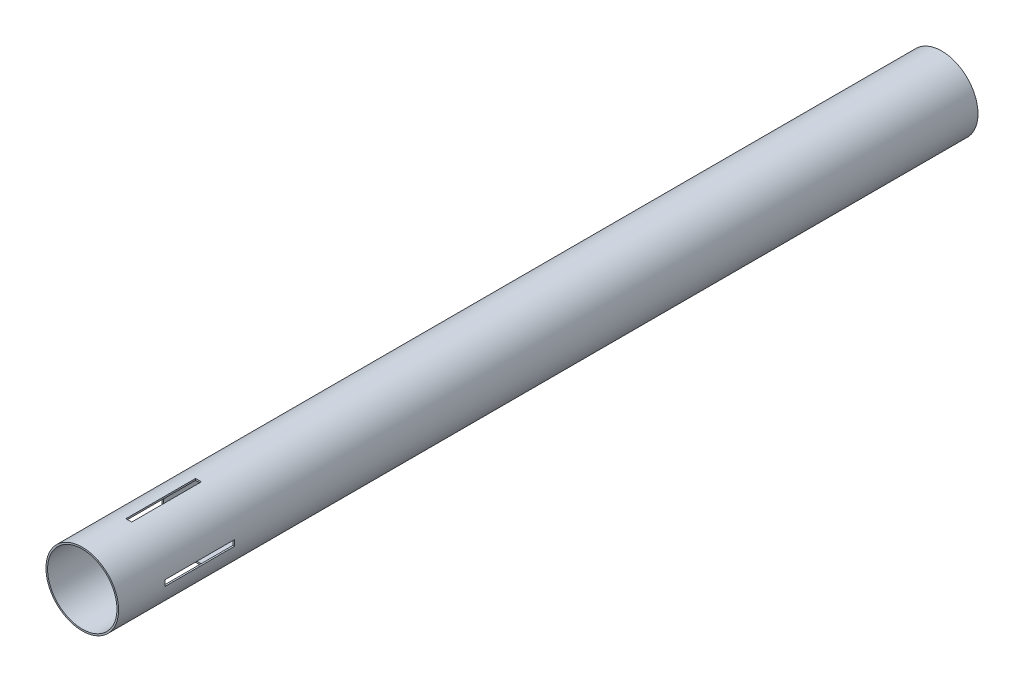
ISO-10303-21;
HEADER;
FILE_DESCRIPTION(('STEP AP214'),'2;1');
FILE_NAME('part.step','',(''),(''),'','','');
FILE_SCHEMA(('AUTOMOTIVE_DESIGN { 1 0 10303 214 1 1 1 1 }'));
ENDSEC;
DATA;
#1=APPLICATION_CONTEXT('core data for automotive mechanical design processes');
#2=APPLICATION_PROTOCOL_DEFINITION('international standard','automotive_design',2000,#1);
#3=PRODUCT_CONTEXT('',#1,'mechanical');
#4=PRODUCT('Part','Part','',(#3));
#5=PRODUCT_RELATED_PRODUCT_CATEGORY('part','',(#4));
#6=PRODUCT_DEFINITION_FORMATION('','',#4);
#7=PRODUCT_DEFINITION_CONTEXT('part definition',#1,'design');
#8=PRODUCT_DEFINITION('design','',#6,#7);
#9=PRODUCT_DEFINITION_SHAPE('','',#8);
#10=(LENGTH_UNIT() NAMED_UNIT(*) SI_UNIT(.MILLI.,.METRE.));
#11=(NAMED_UNIT(*) PLANE_ANGLE_UNIT() SI_UNIT($,.RADIAN.));
#12=(NAMED_UNIT(*) SI_UNIT($,.STERADIAN.) SOLID_ANGLE_UNIT());
#13=UNCERTAINTY_MEASURE_WITH_UNIT(LENGTH_MEASURE(1.E-05),#10,'distance_accuracy_value','');
#14=(GEOMETRIC_REPRESENTATION_CONTEXT(3) GLOBAL_UNCERTAINTY_ASSIGNED_CONTEXT((#13)) GLOBAL_UNIT_ASSIGNED_CONTEXT((#10,
#11,#12)) REPRESENTATION_CONTEXT('',''));
#15=CARTESIAN_POINT('',(0.,0.,0.));
#16=DIRECTION('',(0.,0.,1.));
#17=DIRECTION('',(1.,0.,0.));
#18=AXIS2_PLACEMENT_3D('',#15,#16,#17);
#19=CARTESIAN_POINT('',(0.,0.,939.8));
#20=DIRECTION('',(0.,0.,-1.));
#21=DIRECTION('',(-1.,0.,0.));
#22=AXIS2_PLACEMENT_3D('',#19,#20,#21);
#23=CYLINDRICAL_SURFACE('',#22,39.7129);
#24=DIRECTION('',(0.,0.,-1.));
#25=VECTOR('',#24,1.);
#26=CARTESIAN_POINT('',(3.175,-39.585777766895,939.8));
#27=LINE('',#26,#25);
#28=CARTESIAN_POINT('',(3.175,-39.585777766895,889.));
#29=VERTEX_POINT('',#28);
#30=CARTESIAN_POINT('',(3.175,-39.585777766895,812.8));
#31=VERTEX_POINT('',#30);
#32=EDGE_CURVE('E222',#29,#31,#27,.T.);
#33=ORIENTED_EDGE('',*,*,#32,.T.);
#34=CARTESIAN_POINT('',(0.,0.,812.8));
#35=DIRECTION('',(0.,0.,-1.));
#36=DIRECTION('',(-1.,0.,0.));
#37=AXIS2_PLACEMENT_3D('',#34,#35,#36);
#38=CIRCLE('',#37,39.7129);
#39=CARTESIAN_POINT('',(-3.175,-39.585777766895,812.8));
#40=VERTEX_POINT('',#39);
#41=EDGE_CURVE('E221',#31,#40,#38,.T.);
#42=ORIENTED_EDGE('',*,*,#41,.T.);
#43=DIRECTION('',(0.,0.,-1.));
#44=VECTOR('',#43,1.);
#45=CARTESIAN_POINT('',(-3.175,-39.585777766895,939.8));
#46=LINE('',#45,#44);
#47=CARTESIAN_POINT('',(-3.175,-39.585777766895,889.));
#48=VERTEX_POINT('',#47);
#49=EDGE_CURVE('E216',#40,#48,#46,.F.);
#50=ORIENTED_EDGE('',*,*,#49,.T.);
#51=CARTESIAN_POINT('',(0.,0.,889.));
#52=DIRECTION('',(0.,0.,1.));
#53=DIRECTION('',(1.,0.,0.));
#54=AXIS2_PLACEMENT_3D('',#51,#52,#53);
#55=CIRCLE('',#54,39.7129);
#56=EDGE_CURVE('E212',#48,#29,#55,.T.);
#57=ORIENTED_EDGE('',*,*,#56,.T.);
#58=EDGE_LOOP('',(#33,#42,#50,#57));
#59=FACE_BOUND('',#58,.T.);
#60=DIRECTION('',(0.,0.,-1.));
#61=VECTOR('',#60,1.);
#62=CARTESIAN_POINT('',(-3.175,39.585777766895,939.8));
#63=LINE('',#62,#61);
#64=CARTESIAN_POINT('',(-3.175,39.585777766895,889.));
#65=VERTEX_POINT('',#64);
#66=CARTESIAN_POINT('',(-3.175,39.585777766895,812.8));
#67=VERTEX_POINT('',#66);
#68=EDGE_CURVE('E213',#65,#67,#63,.T.);
#69=ORIENTED_EDGE('',*,*,#68,.T.);
#70=CARTESIAN_POINT('',(3.175,39.585777766895,812.8));
#71=VERTEX_POINT('',#70);
#72=EDGE_CURVE('E219',#67,#71,#38,.T.);
#73=ORIENTED_EDGE('',*,*,#72,.T.);
#74=DIRECTION('',(0.,0.,-1.));
#75=VECTOR('',#74,1.);
#76=CARTESIAN_POINT('',(3.175,39.585777766895,939.8));
#77=LINE('',#76,#75);
#78=CARTESIAN_POINT('',(3.175,39.585777766895,889.));
#79=VERTEX_POINT('',#78);
#80=EDGE_CURVE('E225',#71,#79,#77,.F.);
#81=ORIENTED_EDGE('',*,*,#80,.T.);
#82=EDGE_CURVE('E208',#79,#65,#55,.T.);
#83=ORIENTED_EDGE('',*,*,#82,.T.);
#84=EDGE_LOOP('',(#69,#73,#81,#83));
#85=FACE_BOUND('',#84,.T.);
#86=CARTESIAN_POINT('',(0.,0.,939.8));
#87=DIRECTION('',(0.,0.,1.));
#88=DIRECTION('',(1.,0.,0.));
#89=AXIS2_PLACEMENT_3D('',#86,#87,#88);
#90=CIRCLE('',#89,39.7129);
#91=CARTESIAN_POINT('',(39.7129,0.,939.8));
#92=VERTEX_POINT('',#91);
#93=EDGE_CURVE('E198',#92,#92,#90,.T.);
#94=ORIENTED_EDGE('',*,*,#93,.F.);
#95=EDGE_LOOP('',(#94));
#96=FACE_BOUND('',#95,.T.);
#97=CARTESIAN_POINT('',(0.,0.,0.));
#98=DIRECTION('',(0.,0.,1.));
#99=DIRECTION('',(1.,0.,0.));
#100=AXIS2_PLACEMENT_3D('',#97,#98,#99);
#101=CIRCLE('',#100,39.7129);
#102=CARTESIAN_POINT('',(39.7129,0.,0.));
#103=VERTEX_POINT('',#102);
#104=EDGE_CURVE('E199',#103,#103,#101,.T.);
#105=ORIENTED_EDGE('',*,*,#104,.T.);
#106=EDGE_LOOP('',(#105));
#107=FACE_BOUND('',#106,.T.);
#108=CARTESIAN_POINT('',(0.,0.,889.));
#109=DIRECTION('',(0.,0.,-1.));
#110=DIRECTION('',(-1.,0.,0.));
#111=AXIS2_PLACEMENT_3D('',#108,#109,#110);
#112=CIRCLE('',#111,39.7129);
#113=CARTESIAN_POINT('',(39.585777766895,3.175,889.));
#114=VERTEX_POINT('',#113);
#115=CARTESIAN_POINT('',(39.585777766895,-3.175,889.));
#116=VERTEX_POINT('',#115);
#117=EDGE_CURVE('E252',#114,#116,#112,.T.);
#118=ORIENTED_EDGE('',*,*,#117,.F.);
#119=DIRECTION('',(0.,0.,-1.));
#120=VECTOR('',#119,1.);
#121=CARTESIAN_POINT('',(39.585777766895,3.175,939.8));
#122=LINE('',#121,#120);
#123=CARTESIAN_POINT('',(39.585777766895,3.175,812.8));
#124=VERTEX_POINT('',#123);
#125=EDGE_CURVE('E256',#124,#114,#122,.F.);
#126=ORIENTED_EDGE('',*,*,#125,.F.);
#127=CARTESIAN_POINT('',(0.,0.,812.8));
#128=DIRECTION('',(0.,0.,1.));
#129=DIRECTION('',(1.,0.,0.));
#130=AXIS2_PLACEMENT_3D('',#127,#128,#129);
#131=CIRCLE('',#130,39.7129);
#132=CARTESIAN_POINT('',(39.585777766895,-3.175,812.8));
#133=VERTEX_POINT('',#132);
#134=EDGE_CURVE('E245',#133,#124,#131,.T.);
#135=ORIENTED_EDGE('',*,*,#134,.F.);
#136=DIRECTION('',(0.,0.,-1.));
#137=VECTOR('',#136,1.);
#138=CARTESIAN_POINT('',(39.585777766895,-3.175,939.8));
#139=LINE('',#138,#137);
#140=EDGE_CURVE('E246',#116,#133,#139,.T.);
#141=ORIENTED_EDGE('',*,*,#140,.F.);
#142=EDGE_LOOP('',(#118,#126,#135,#141));
#143=FACE_BOUND('',#142,.T.);
#144=CARTESIAN_POINT('',(-39.585777766895,-3.175,889.));
#145=VERTEX_POINT('',#144);
#146=CARTESIAN_POINT('',(-39.585777766895,3.175,889.));
#147=VERTEX_POINT('',#146);
#148=EDGE_CURVE('E162',#145,#147,#112,.T.);
#149=ORIENTED_EDGE('',*,*,#148,.F.);
#150=DIRECTION('',(0.,0.,-1.));
#151=VECTOR('',#150,1.);
#152=CARTESIAN_POINT('',(-39.585777766895,-3.175,939.8));
#153=LINE('',#152,#151);
#154=CARTESIAN_POINT('',(-39.585777766895,-3.175,812.8));
#155=VERTEX_POINT('',#154);
#156=EDGE_CURVE('E249',#155,#145,#153,.F.);
#157=ORIENTED_EDGE('',*,*,#156,.F.);
#158=CARTESIAN_POINT('',(-39.585777766895,3.175,812.8));
#159=VERTEX_POINT('',#158);
#160=EDGE_CURVE('E232',#159,#155,#131,.T.);
#161=ORIENTED_EDGE('',*,*,#160,.F.);
#162=DIRECTION('',(0.,0.,-1.));
#163=VECTOR('',#162,1.);
#164=CARTESIAN_POINT('',(-39.585777766895,3.175,939.8));
#165=LINE('',#164,#163);
#166=EDGE_CURVE('E254',#147,#159,#165,.T.);
#167=ORIENTED_EDGE('',*,*,#166,.F.);
#168=EDGE_LOOP('',(#149,#157,#161,#167));
#169=FACE_BOUND('',#168,.T.);
#170=ADVANCED_FACE('F38',(#59,#85,#96,#107,#143,#169),#23,.T.);
#171=CARTESIAN_POINT('',(0.,0.,939.8));
#172=DIRECTION('',(0.,0.,-1.));
#173=DIRECTION('',(-1.,0.,0.));
#174=AXIS2_PLACEMENT_3D('',#171,#172,#173);
#175=CYLINDRICAL_SURFACE('',#174,37.9603);
#176=CARTESIAN_POINT('',(0.,0.,889.));
#177=DIRECTION('',(0.,0.,1.));
#178=DIRECTION('',(1.,0.,0.));
#179=AXIS2_PLACEMENT_3D('',#176,#177,#178);
#180=CIRCLE('',#179,37.9603);
#181=CARTESIAN_POINT('',(-3.175,-37.8272884448516,889.));
#182=VERTEX_POINT('',#181);
#183=CARTESIAN_POINT('',(3.175,-37.8272884448516,889.));
#184=VERTEX_POINT('',#183);
#185=EDGE_CURVE('E180',#182,#184,#180,.T.);
#186=ORIENTED_EDGE('',*,*,#185,.F.);
#187=DIRECTION('',(0.,0.,-1.));
#188=VECTOR('',#187,1.);
#189=CARTESIAN_POINT('',(-3.175,-37.8272884448516,939.8));
#190=LINE('',#189,#188);
#191=CARTESIAN_POINT('',(-3.175,-37.8272884448516,812.8));
#192=VERTEX_POINT('',#191);
#193=EDGE_CURVE('E183',#192,#182,#190,.F.);
#194=ORIENTED_EDGE('',*,*,#193,.F.);
#195=CARTESIAN_POINT('',(0.,0.,812.8));
#196=DIRECTION('',(0.,0.,-1.));
#197=DIRECTION('',(-1.,0.,0.));
#198=AXIS2_PLACEMENT_3D('',#195,#196,#197);
#199=CIRCLE('',#198,37.9603);
#200=CARTESIAN_POINT('',(3.175,-37.8272884448516,812.8));
#201=VERTEX_POINT('',#200);
#202=EDGE_CURVE('E188',#201,#192,#199,.T.);
#203=ORIENTED_EDGE('',*,*,#202,.F.);
#204=DIRECTION('',(0.,0.,-1.));
#205=VECTOR('',#204,1.);
#206=CARTESIAN_POINT('',(3.175,-37.8272884448516,939.8));
#207=LINE('',#206,#205);
#208=EDGE_CURVE('E189',#184,#201,#207,.T.);
#209=ORIENTED_EDGE('',*,*,#208,.F.);
#210=EDGE_LOOP('',(#186,#194,#203,#209));
#211=FACE_BOUND('',#210,.T.);
#212=CARTESIAN_POINT('',(3.175,37.8272884448516,889.));
#213=VERTEX_POINT('',#212);
#214=CARTESIAN_POINT('',(-3.175,37.8272884448516,889.));
#215=VERTEX_POINT('',#214);
#216=EDGE_CURVE('E185',#213,#215,#180,.T.);
#217=ORIENTED_EDGE('',*,*,#216,.F.);
#218=DIRECTION('',(0.,0.,-1.));
#219=VECTOR('',#218,1.);
#220=CARTESIAN_POINT('',(3.175,37.8272884448516,939.8));
#221=LINE('',#220,#219);
#222=CARTESIAN_POINT('',(3.175,37.8272884448516,812.8));
#223=VERTEX_POINT('',#222);
#224=EDGE_CURVE('E196',#223,#213,#221,.F.);
#225=ORIENTED_EDGE('',*,*,#224,.F.);
#226=CARTESIAN_POINT('',(-3.175,37.8272884448516,812.8));
#227=VERTEX_POINT('',#226);
#228=EDGE_CURVE('E193',#227,#223,#199,.T.);
#229=ORIENTED_EDGE('',*,*,#228,.F.);
#230=DIRECTION('',(0.,0.,-1.));
#231=VECTOR('',#230,1.);
#232=CARTESIAN_POINT('',(-3.175,37.8272884448516,939.8));
#233=LINE('',#232,#231);
#234=EDGE_CURVE('E191',#215,#227,#233,.T.);
#235=ORIENTED_EDGE('',*,*,#234,.F.);
#236=EDGE_LOOP('',(#217,#225,#229,#235));
#237=FACE_BOUND('',#236,.T.);
#238=CARTESIAN_POINT('',(0.,0.,939.8));
#239=DIRECTION('',(0.,0.,1.));
#240=DIRECTION('',(1.,0.,0.));
#241=AXIS2_PLACEMENT_3D('',#238,#239,#240);
#242=CIRCLE('',#241,37.9603);
#243=CARTESIAN_POINT('',(37.9603,0.,939.8));
#244=VERTEX_POINT('',#243);
#245=EDGE_CURVE('E202',#244,#244,#242,.T.);
#246=ORIENTED_EDGE('',*,*,#245,.T.);
#247=EDGE_LOOP('',(#246));
#248=FACE_BOUND('',#247,.T.);
#249=CARTESIAN_POINT('',(0.,0.,0.));
#250=DIRECTION('',(0.,0.,1.));
#251=DIRECTION('',(1.,0.,0.));
#252=AXIS2_PLACEMENT_3D('',#249,#250,#251);
#253=CIRCLE('',#252,37.9603);
#254=CARTESIAN_POINT('',(37.9603,0.,0.));
#255=VERTEX_POINT('',#254);
#256=EDGE_CURVE('E205',#255,#255,#253,.T.);
#257=ORIENTED_EDGE('',*,*,#256,.F.);
#258=EDGE_LOOP('',(#257));
#259=FACE_BOUND('',#258,.T.);
#260=DIRECTION('',(0.,0.,-1.));
#261=VECTOR('',#260,1.);
#262=CARTESIAN_POINT('',(37.8272884448516,-3.175,939.8));
#263=LINE('',#262,#261);
#264=CARTESIAN_POINT('',(37.8272884448516,-3.175,889.));
#265=VERTEX_POINT('',#264);
#266=CARTESIAN_POINT('',(37.8272884448516,-3.175,812.8));
#267=VERTEX_POINT('',#266);
#268=EDGE_CURVE('E174',#265,#267,#263,.T.);
#269=ORIENTED_EDGE('',*,*,#268,.T.);
#270=CARTESIAN_POINT('',(0.,0.,812.8));
#271=DIRECTION('',(0.,0.,1.));
#272=DIRECTION('',(1.,0.,0.));
#273=AXIS2_PLACEMENT_3D('',#270,#271,#272);
#274=CIRCLE('',#273,37.9603);
#275=CARTESIAN_POINT('',(37.8272884448516,3.175,812.8));
#276=VERTEX_POINT('',#275);
#277=EDGE_CURVE('E47',#267,#276,#274,.T.);
#278=ORIENTED_EDGE('',*,*,#277,.T.);
#279=DIRECTION('',(0.,0.,-1.));
#280=VECTOR('',#279,1.);
#281=CARTESIAN_POINT('',(37.8272884448516,3.175,939.8));
#282=LINE('',#281,#280);
#283=CARTESIAN_POINT('',(37.8272884448516,3.175,889.));
#284=VERTEX_POINT('',#283);
#285=EDGE_CURVE('E175',#276,#284,#282,.F.);
#286=ORIENTED_EDGE('',*,*,#285,.T.);
#287=CARTESIAN_POINT('',(0.,0.,889.));
#288=DIRECTION('',(0.,0.,-1.));
#289=DIRECTION('',(-1.,0.,0.));
#290=AXIS2_PLACEMENT_3D('',#287,#288,#289);
#291=CIRCLE('',#290,37.9603);
#292=EDGE_CURVE('E170',#284,#265,#291,.T.);
#293=ORIENTED_EDGE('',*,*,#292,.T.);
#294=EDGE_LOOP('',(#269,#278,#286,#293));
#295=FACE_BOUND('',#294,.T.);
#296=DIRECTION('',(0.,0.,-1.));
#297=VECTOR('',#296,1.);
#298=CARTESIAN_POINT('',(-37.8272884448516,3.175,939.8));
#299=LINE('',#298,#297);
#300=CARTESIAN_POINT('',(-37.8272884448516,3.175,889.));
#301=VERTEX_POINT('',#300);
#302=CARTESIAN_POINT('',(-37.8272884448516,3.175,812.8));
#303=VERTEX_POINT('',#302);
#304=EDGE_CURVE('E150',#301,#303,#299,.T.);
#305=ORIENTED_EDGE('',*,*,#304,.T.);
#306=CARTESIAN_POINT('',(-37.8272884448516,-3.175,812.8));
#307=VERTEX_POINT('',#306);
#308=EDGE_CURVE('E11',#303,#307,#274,.T.);
#309=ORIENTED_EDGE('',*,*,#308,.T.);
#310=DIRECTION('',(0.,0.,-1.));
#311=VECTOR('',#310,1.);
#312=CARTESIAN_POINT('',(-37.8272884448516,-3.175,939.8));
#313=LINE('',#312,#311);
#314=CARTESIAN_POINT('',(-37.8272884448516,-3.175,889.));
#315=VERTEX_POINT('',#314);
#316=EDGE_CURVE('E41',#307,#315,#313,.F.);
#317=ORIENTED_EDGE('',*,*,#316,.T.);
#318=EDGE_CURVE('E157',#315,#301,#291,.T.);
#319=ORIENTED_EDGE('',*,*,#318,.T.);
#320=EDGE_LOOP('',(#305,#309,#317,#319));
#321=FACE_BOUND('',#320,.T.);
#322=ADVANCED_FACE('F168',(#211,#237,#248,#259,#295,#321),#175,.F.);
#323=CARTESIAN_POINT('',(0.,0.,939.8));
#324=DIRECTION('',(0.,0.,1.));
#325=DIRECTION('',(1.,0.,0.));
#326=AXIS2_PLACEMENT_3D('',#323,#324,#325);
#327=PLANE('',#326);
#328=ORIENTED_EDGE('',*,*,#93,.T.);
#329=EDGE_LOOP('',(#328));
#330=FACE_BOUND('',#329,.T.);
#331=ORIENTED_EDGE('',*,*,#245,.F.);
#332=EDGE_LOOP('',(#331));
#333=FACE_BOUND('',#332,.T.);
#334=ADVANCED_FACE('F280',(#330,#333),#327,.T.);
#335=CARTESIAN_POINT('',(0.,0.,0.));
#336=DIRECTION('',(0.,0.,1.));
#337=DIRECTION('',(1.,0.,0.));
#338=AXIS2_PLACEMENT_3D('',#335,#336,#337);
#339=PLANE('',#338);
#340=ORIENTED_EDGE('',*,*,#104,.F.);
#341=EDGE_LOOP('',(#340));
#342=FACE_BOUND('',#341,.T.);
#343=ORIENTED_EDGE('',*,*,#256,.T.);
#344=EDGE_LOOP('',(#343));
#345=FACE_BOUND('',#344,.T.);
#346=ADVANCED_FACE('F287',(#342,#345),#339,.F.);
#347=CARTESIAN_POINT('',(3.175,-39.7129,812.8));
#348=DIRECTION('',(1.,0.,0.));
#349=DIRECTION('',(0.,0.,-1.));
#350=AXIS2_PLACEMENT_3D('',#347,#348,#349);
#351=PLANE('',#350);
#352=DIRECTION('',(0.,1.,0.));
#353=VECTOR('',#352,1.);
#354=CARTESIAN_POINT('',(3.175,-39.7129,812.8));
#355=LINE('',#354,#353);
#356=EDGE_CURVE('E233',#223,#71,#355,.T.);
#357=ORIENTED_EDGE('',*,*,#356,.F.);
#358=ORIENTED_EDGE('',*,*,#224,.T.);
#359=DIRECTION('',(0.,1.,0.));
#360=VECTOR('',#359,1.);
#361=CARTESIAN_POINT('',(3.175,-39.7129,889.));
#362=LINE('',#361,#360);
#363=EDGE_CURVE('E229',#213,#79,#362,.T.);
#364=ORIENTED_EDGE('',*,*,#363,.T.);
#365=ORIENTED_EDGE('',*,*,#80,.F.);
#366=EDGE_LOOP('',(#357,#358,#364,#365));
#367=FACE_BOUND('',#366,.T.);
#368=ADVANCED_FACE('F297',(#367),#351,.F.);
#369=CARTESIAN_POINT('',(-3.175,-39.7129,812.8));
#370=DIRECTION('',(0.,0.,-1.));
#371=DIRECTION('',(-1.,0.,0.));
#372=AXIS2_PLACEMENT_3D('',#369,#370,#371);
#373=PLANE('',#372);
#374=DIRECTION('',(0.,1.,0.));
#375=VECTOR('',#374,1.);
#376=CARTESIAN_POINT('',(-3.175,-39.7129,812.8));
#377=LINE('',#376,#375);
#378=EDGE_CURVE('E237',#227,#67,#377,.T.);
#379=ORIENTED_EDGE('',*,*,#378,.F.);
#380=ORIENTED_EDGE('',*,*,#228,.T.);
#381=ORIENTED_EDGE('',*,*,#356,.T.);
#382=ORIENTED_EDGE('',*,*,#72,.F.);
#383=EDGE_LOOP('',(#379,#380,#381,#382));
#384=FACE_BOUND('',#383,.T.);
#385=ADVANCED_FACE('F302',(#384),#373,.F.);
#386=CARTESIAN_POINT('',(-3.175,-39.7129,889.));
#387=DIRECTION('',(-1.,0.,0.));
#388=DIRECTION('',(0.,0.,1.));
#389=AXIS2_PLACEMENT_3D('',#386,#387,#388);
#390=PLANE('',#389);
#391=DIRECTION('',(0.,1.,0.));
#392=VECTOR('',#391,1.);
#393=CARTESIAN_POINT('',(-3.175,-39.7129,889.));
#394=LINE('',#393,#392);
#395=EDGE_CURVE('E241',#215,#65,#394,.T.);
#396=ORIENTED_EDGE('',*,*,#395,.F.);
#397=ORIENTED_EDGE('',*,*,#234,.T.);
#398=ORIENTED_EDGE('',*,*,#378,.T.);
#399=ORIENTED_EDGE('',*,*,#68,.F.);
#400=EDGE_LOOP('',(#396,#397,#398,#399));
#401=FACE_BOUND('',#400,.T.);
#402=ADVANCED_FACE('F313',(#401),#390,.F.);
#403=CARTESIAN_POINT('',(3.175,-39.7129,889.));
#404=DIRECTION('',(0.,0.,1.));
#405=DIRECTION('',(1.,0.,0.));
#406=AXIS2_PLACEMENT_3D('',#403,#404,#405);
#407=PLANE('',#406);
#408=ORIENTED_EDGE('',*,*,#363,.F.);
#409=ORIENTED_EDGE('',*,*,#216,.T.);
#410=ORIENTED_EDGE('',*,*,#395,.T.);
#411=ORIENTED_EDGE('',*,*,#82,.F.);
#412=EDGE_LOOP('',(#408,#409,#410,#411));
#413=FACE_BOUND('',#412,.T.);
#414=ADVANCED_FACE('F294',(#413),#407,.F.);
#415=EDGE_CURVE('E228',#48,#182,#394,.T.);
#416=ORIENTED_EDGE('',*,*,#415,.T.);
#417=ORIENTED_EDGE('',*,*,#185,.T.);
#418=EDGE_CURVE('E231',#29,#184,#362,.T.);
#419=ORIENTED_EDGE('',*,*,#418,.F.);
#420=ORIENTED_EDGE('',*,*,#56,.F.);
#421=EDGE_LOOP('',(#416,#417,#419,#420));
#422=FACE_BOUND('',#421,.T.);
#423=ADVANCED_FACE('F333',(#422),#407,.F.);
#424=EDGE_CURVE('E240',#40,#192,#377,.T.);
#425=ORIENTED_EDGE('',*,*,#424,.T.);
#426=ORIENTED_EDGE('',*,*,#193,.T.);
#427=ORIENTED_EDGE('',*,*,#415,.F.);
#428=ORIENTED_EDGE('',*,*,#49,.F.);
#429=EDGE_LOOP('',(#425,#426,#427,#428));
#430=FACE_BOUND('',#429,.T.);
#431=ADVANCED_FACE('F325',(#430),#390,.F.);
#432=EDGE_CURVE('E236',#31,#201,#355,.T.);
#433=ORIENTED_EDGE('',*,*,#432,.T.);
#434=ORIENTED_EDGE('',*,*,#202,.T.);
#435=ORIENTED_EDGE('',*,*,#424,.F.);
#436=ORIENTED_EDGE('',*,*,#41,.F.);
#437=EDGE_LOOP('',(#433,#434,#435,#436));
#438=FACE_BOUND('',#437,.T.);
#439=ADVANCED_FACE('F316',(#438),#373,.F.);
#440=ORIENTED_EDGE('',*,*,#418,.T.);
#441=ORIENTED_EDGE('',*,*,#208,.T.);
#442=ORIENTED_EDGE('',*,*,#432,.F.);
#443=ORIENTED_EDGE('',*,*,#32,.F.);
#444=EDGE_LOOP('',(#440,#441,#442,#443));
#445=FACE_BOUND('',#444,.T.);
#446=ADVANCED_FACE('F304',(#445),#351,.F.);
#447=CARTESIAN_POINT('',(-39.7129,3.175,889.));
#448=DIRECTION('',(0.,-1.,0.));
#449=DIRECTION('',(0.,0.,-1.));
#450=AXIS2_PLACEMENT_3D('',#447,#448,#449);
#451=PLANE('',#450);
#452=ORIENTED_EDGE('',*,*,#125,.T.);
#453=DIRECTION('',(1.,0.,0.));
#454=VECTOR('',#453,1.);
#455=CARTESIAN_POINT('',(-39.7129,3.175,889.));
#456=LINE('',#455,#454);
#457=EDGE_CURVE('E165',#284,#114,#456,.T.);
#458=ORIENTED_EDGE('',*,*,#457,.F.);
#459=ORIENTED_EDGE('',*,*,#285,.F.);
#460=DIRECTION('',(1.,0.,0.));
#461=VECTOR('',#460,1.);
#462=CARTESIAN_POINT('',(-39.7129,3.175,812.8));
#463=LINE('',#462,#461);
#464=EDGE_CURVE('E62',#276,#124,#463,.T.);
#465=ORIENTED_EDGE('',*,*,#464,.T.);
#466=EDGE_LOOP('',(#452,#458,#459,#465));
#467=FACE_BOUND('',#466,.T.);
#468=ADVANCED_FACE('F318',(#467),#451,.T.);
#469=CARTESIAN_POINT('',(-39.7129,-3.175,889.));
#470=DIRECTION('',(0.,0.,-1.));
#471=DIRECTION('',(-1.,0.,0.));
#472=AXIS2_PLACEMENT_3D('',#469,#470,#471);
#473=PLANE('',#472);
#474=ORIENTED_EDGE('',*,*,#117,.T.);
#475=DIRECTION('',(1.,0.,0.));
#476=VECTOR('',#475,1.);
#477=CARTESIAN_POINT('',(-39.7129,-3.175,889.));
#478=LINE('',#477,#476);
#479=EDGE_CURVE('E164',#265,#116,#478,.T.);
#480=ORIENTED_EDGE('',*,*,#479,.F.);
#481=ORIENTED_EDGE('',*,*,#292,.F.);
#482=ORIENTED_EDGE('',*,*,#457,.T.);
#483=EDGE_LOOP('',(#474,#480,#481,#482));
#484=FACE_BOUND('',#483,.T.);
#485=ADVANCED_FACE('F268',(#484),#473,.T.);
#486=CARTESIAN_POINT('',(-39.7129,-3.175,812.8));
#487=DIRECTION('',(0.,1.,0.));
#488=DIRECTION('',(0.,0.,1.));
#489=AXIS2_PLACEMENT_3D('',#486,#487,#488);
#490=PLANE('',#489);
#491=ORIENTED_EDGE('',*,*,#140,.T.);
#492=DIRECTION('',(1.,0.,0.));
#493=VECTOR('',#492,1.);
#494=CARTESIAN_POINT('',(-39.7129,-3.175,812.8));
#495=LINE('',#494,#493);
#496=EDGE_CURVE('E259',#267,#133,#495,.T.);
#497=ORIENTED_EDGE('',*,*,#496,.F.);
#498=ORIENTED_EDGE('',*,*,#268,.F.);
#499=ORIENTED_EDGE('',*,*,#479,.T.);
#500=EDGE_LOOP('',(#491,#497,#498,#499));
#501=FACE_BOUND('',#500,.T.);
#502=ADVANCED_FACE('F276',(#501),#490,.T.);
#503=CARTESIAN_POINT('',(-39.7129,3.175,812.8));
#504=DIRECTION('',(0.,0.,1.));
#505=DIRECTION('',(1.,0.,0.));
#506=AXIS2_PLACEMENT_3D('',#503,#504,#505);
#507=PLANE('',#506);
#508=ORIENTED_EDGE('',*,*,#134,.T.);
#509=ORIENTED_EDGE('',*,*,#464,.F.);
#510=ORIENTED_EDGE('',*,*,#277,.F.);
#511=ORIENTED_EDGE('',*,*,#496,.T.);
#512=EDGE_LOOP('',(#508,#509,#510,#511));
#513=FACE_BOUND('',#512,.T.);
#514=ADVANCED_FACE('F278',(#513),#507,.T.);
#515=ORIENTED_EDGE('',*,*,#160,.T.);
#516=EDGE_CURVE('E258',#155,#307,#495,.T.);
#517=ORIENTED_EDGE('',*,*,#516,.T.);
#518=ORIENTED_EDGE('',*,*,#308,.F.);
#519=EDGE_CURVE('E153',#159,#303,#463,.T.);
#520=ORIENTED_EDGE('',*,*,#519,.F.);
#521=EDGE_LOOP('',(#515,#517,#518,#520));
#522=FACE_BOUND('',#521,.T.);
#523=ADVANCED_FACE('F424',(#522),#507,.T.);
#524=ORIENTED_EDGE('',*,*,#156,.T.);
#525=EDGE_CURVE('E262',#145,#315,#478,.T.);
#526=ORIENTED_EDGE('',*,*,#525,.T.);
#527=ORIENTED_EDGE('',*,*,#316,.F.);
#528=ORIENTED_EDGE('',*,*,#516,.F.);
#529=EDGE_LOOP('',(#524,#526,#527,#528));
#530=FACE_BOUND('',#529,.T.);
#531=ADVANCED_FACE('F416',(#530),#490,.T.);
#532=ORIENTED_EDGE('',*,*,#148,.T.);
#533=EDGE_CURVE('E54',#147,#301,#456,.T.);
#534=ORIENTED_EDGE('',*,*,#533,.T.);
#535=ORIENTED_EDGE('',*,*,#318,.F.);
#536=ORIENTED_EDGE('',*,*,#525,.F.);
#537=EDGE_LOOP('',(#532,#534,#535,#536));
#538=FACE_BOUND('',#537,.T.);
#539=ADVANCED_FACE('F159',(#538),#473,.T.);
#540=ORIENTED_EDGE('',*,*,#166,.T.);
#541=ORIENTED_EDGE('',*,*,#519,.T.);
#542=ORIENTED_EDGE('',*,*,#304,.F.);
#543=ORIENTED_EDGE('',*,*,#533,.F.);
#544=EDGE_LOOP('',(#540,#541,#542,#543));
#545=FACE_BOUND('',#544,.T.);
#546=ADVANCED_FACE('F151',(#545),#451,.T.);
#547=CLOSED_SHELL('',(#170,#322,#334,#346,#368,#385,#402,#414,#423,#431,#439,#446,#468,#485,
#502,#514,#523,#531,#539,#546));
#548=MANIFOLD_SOLID_BREP('B2',#547);
#549=ADVANCED_BREP_SHAPE_REPRESENTATION('',(#18,#548),#14);
#550=SHAPE_DEFINITION_REPRESENTATION(#9,#549);
ENDSEC;
END-ISO-10303-21;
